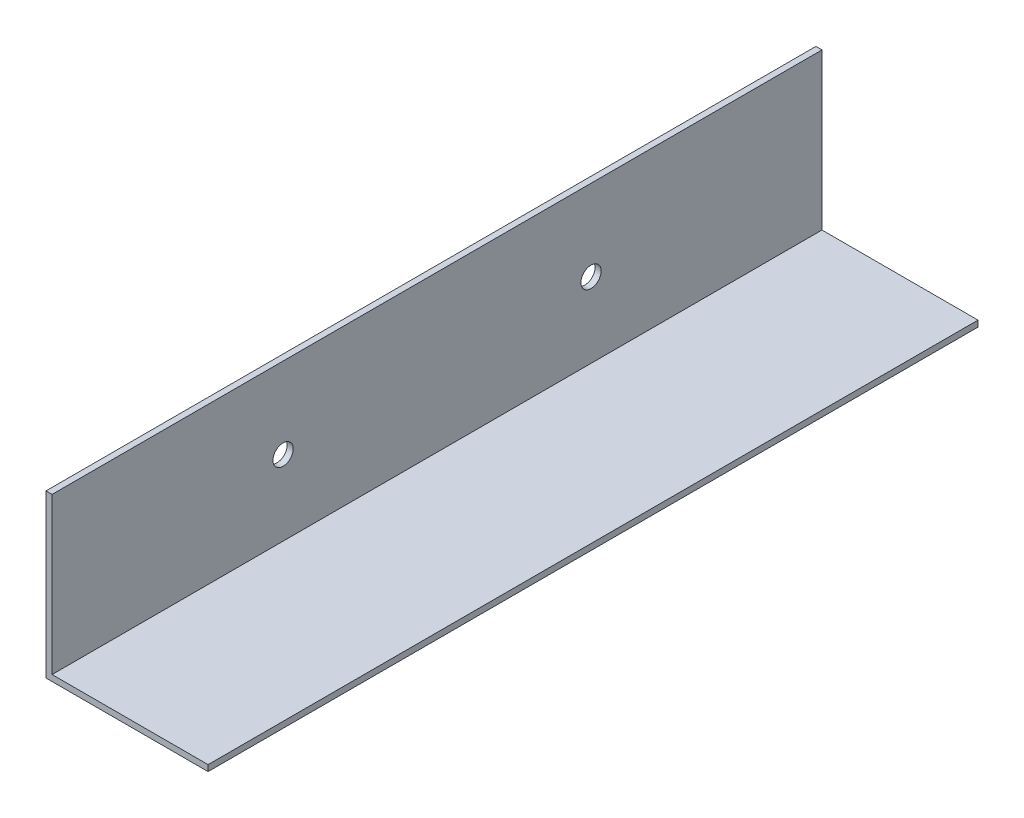
ISO-10303-21;
HEADER;
FILE_DESCRIPTION(('STEP AP214'),'2;1');
FILE_NAME('part.step','',(''),(''),'','','');
FILE_SCHEMA(('AUTOMOTIVE_DESIGN { 1 0 10303 214 1 1 1 1 }'));
ENDSEC;
DATA;
#1=APPLICATION_CONTEXT('core data for automotive mechanical design processes');
#2=APPLICATION_PROTOCOL_DEFINITION('international standard','automotive_design',2000,#1);
#3=PRODUCT_CONTEXT('',#1,'mechanical');
#4=PRODUCT('Part','Part','',(#3));
#5=PRODUCT_RELATED_PRODUCT_CATEGORY('part','',(#4));
#6=PRODUCT_DEFINITION_FORMATION('','',#4);
#7=PRODUCT_DEFINITION_CONTEXT('part definition',#1,'design');
#8=PRODUCT_DEFINITION('design','',#6,#7);
#9=PRODUCT_DEFINITION_SHAPE('','',#8);
#10=(LENGTH_UNIT() NAMED_UNIT(*) SI_UNIT(.MILLI.,.METRE.));
#11=(NAMED_UNIT(*) PLANE_ANGLE_UNIT() SI_UNIT($,.RADIAN.));
#12=(NAMED_UNIT(*) SI_UNIT($,.STERADIAN.) SOLID_ANGLE_UNIT());
#13=UNCERTAINTY_MEASURE_WITH_UNIT(LENGTH_MEASURE(1.E-05),#10,'distance_accuracy_value','');
#14=(GEOMETRIC_REPRESENTATION_CONTEXT(3) GLOBAL_UNCERTAINTY_ASSIGNED_CONTEXT((#13)) GLOBAL_UNIT_ASSIGNED_CONTEXT((#10,
#11,#12)) REPRESENTATION_CONTEXT('',''));
#15=CARTESIAN_POINT('',(0.,0.,0.));
#16=DIRECTION('',(0.,0.,1.));
#17=DIRECTION('',(1.,0.,0.));
#18=AXIS2_PLACEMENT_3D('',#15,#16,#17);
#19=CARTESIAN_POINT('',(0.,0.,190.));
#20=DIRECTION('',(0.,1.,0.));
#21=DIRECTION('',(0.,0.,1.));
#22=AXIS2_PLACEMENT_3D('',#19,#20,#21);
#23=PLANE('',#22);
#24=DIRECTION('',(1.,0.,0.));
#25=VECTOR('',#24,1.);
#26=CARTESIAN_POINT('',(0.,0.,0.));
#27=LINE('',#26,#25);
#28=CARTESIAN_POINT('',(0.,0.,0.));
#29=VERTEX_POINT('',#28);
#30=CARTESIAN_POINT('',(40.,0.,0.));
#31=VERTEX_POINT('',#30);
#32=EDGE_CURVE('E114',#29,#31,#27,.T.);
#33=ORIENTED_EDGE('',*,*,#32,.T.);
#34=DIRECTION('',(0.,0.,-1.));
#35=VECTOR('',#34,1.);
#36=CARTESIAN_POINT('',(40.,0.,190.));
#37=LINE('',#36,#35);
#38=CARTESIAN_POINT('',(40.,0.,190.));
#39=VERTEX_POINT('',#38);
#40=EDGE_CURVE('E11',#39,#31,#37,.T.);
#41=ORIENTED_EDGE('',*,*,#40,.F.);
#42=DIRECTION('',(1.,0.,0.));
#43=VECTOR('',#42,1.);
#44=CARTESIAN_POINT('',(0.,0.,190.));
#45=LINE('',#44,#43);
#46=CARTESIAN_POINT('',(0.,0.,190.));
#47=VERTEX_POINT('',#46);
#48=EDGE_CURVE('E79',#47,#39,#45,.T.);
#49=ORIENTED_EDGE('',*,*,#48,.F.);
#50=DIRECTION('',(0.,0.,-1.));
#51=VECTOR('',#50,1.);
#52=CARTESIAN_POINT('',(0.,0.,190.));
#53=LINE('',#52,#51);
#54=EDGE_CURVE('E110',#47,#29,#53,.T.);
#55=ORIENTED_EDGE('',*,*,#54,.T.);
#56=EDGE_LOOP('',(#33,#41,#49,#55));
#57=FACE_BOUND('',#56,.T.);
#58=ADVANCED_FACE('F33',(#57),#23,.F.);
#59=CARTESIAN_POINT('',(40.,1.5,190.));
#60=DIRECTION('',(1.,0.,0.));
#61=DIRECTION('',(0.,0.,-1.));
#62=AXIS2_PLACEMENT_3D('',#59,#60,#61);
#63=PLANE('',#62);
#64=DIRECTION('',(0.,-1.,0.));
#65=VECTOR('',#64,1.);
#66=CARTESIAN_POINT('',(40.,1.5,0.));
#67=LINE('',#66,#65);
#68=CARTESIAN_POINT('',(40.,1.5,0.));
#69=VERTEX_POINT('',#68);
#70=EDGE_CURVE('E117',#69,#31,#67,.T.);
#71=ORIENTED_EDGE('',*,*,#70,.F.);
#72=DIRECTION('',(0.,0.,-1.));
#73=VECTOR('',#72,1.);
#74=CARTESIAN_POINT('',(40.,1.5,190.));
#75=LINE('',#74,#73);
#76=CARTESIAN_POINT('',(40.,1.5,190.));
#77=VERTEX_POINT('',#76);
#78=EDGE_CURVE('E41',#77,#69,#75,.T.);
#79=ORIENTED_EDGE('',*,*,#78,.F.);
#80=DIRECTION('',(0.,-1.,0.));
#81=VECTOR('',#80,1.);
#82=CARTESIAN_POINT('',(40.,1.5,190.));
#83=LINE('',#82,#81);
#84=EDGE_CURVE('E181',#77,#39,#83,.T.);
#85=ORIENTED_EDGE('',*,*,#84,.T.);
#86=ORIENTED_EDGE('',*,*,#40,.T.);
#87=EDGE_LOOP('',(#71,#79,#85,#86));
#88=FACE_BOUND('',#87,.T.);
#89=ADVANCED_FACE('F136',(#88),#63,.T.);
#90=CARTESIAN_POINT('',(0.,1.5,190.));
#91=DIRECTION('',(0.,1.,0.));
#92=DIRECTION('',(0.,0.,1.));
#93=AXIS2_PLACEMENT_3D('',#90,#91,#92);
#94=PLANE('',#93);
#95=DIRECTION('',(1.,0.,0.));
#96=VECTOR('',#95,1.);
#97=CARTESIAN_POINT('',(0.,1.5,0.));
#98=LINE('',#97,#96);
#99=CARTESIAN_POINT('',(1.5,1.5,0.));
#100=VERTEX_POINT('',#99);
#101=EDGE_CURVE('E121',#100,#69,#98,.T.);
#102=ORIENTED_EDGE('',*,*,#101,.F.);
#103=DIRECTION('',(0.,0.,-1.));
#104=VECTOR('',#103,1.);
#105=CARTESIAN_POINT('',(1.5,1.5,190.));
#106=LINE('',#105,#104);
#107=CARTESIAN_POINT('',(1.5,1.5,190.));
#108=VERTEX_POINT('',#107);
#109=EDGE_CURVE('E100',#108,#100,#106,.T.);
#110=ORIENTED_EDGE('',*,*,#109,.F.);
#111=DIRECTION('',(1.,0.,0.));
#112=VECTOR('',#111,1.);
#113=CARTESIAN_POINT('',(0.,1.5,190.));
#114=LINE('',#113,#112);
#115=EDGE_CURVE('E106',#108,#77,#114,.T.);
#116=ORIENTED_EDGE('',*,*,#115,.T.);
#117=ORIENTED_EDGE('',*,*,#78,.T.);
#118=EDGE_LOOP('',(#102,#110,#116,#117));
#119=FACE_BOUND('',#118,.T.);
#120=ADVANCED_FACE('F133',(#119),#94,.T.);
#121=CARTESIAN_POINT('',(1.5,40.,190.));
#122=DIRECTION('',(1.,0.,0.));
#123=DIRECTION('',(0.,1.,0.));
#124=AXIS2_PLACEMENT_3D('',#121,#122,#123);
#125=PLANE('',#124);
#126=CARTESIAN_POINT('',(1.49999999999999,20.,133.));
#127=DIRECTION('',(1.,0.,0.));
#128=DIRECTION('',(0.,1.,0.));
#129=AXIS2_PLACEMENT_3D('',#126,#127,#128);
#130=CIRCLE('',#129,2.5);
#131=CARTESIAN_POINT('',(1.49999999999999,22.5,133.));
#132=VERTEX_POINT('',#131);
#133=EDGE_CURVE('E170',#132,#132,#130,.T.);
#134=ORIENTED_EDGE('',*,*,#133,.F.);
#135=EDGE_LOOP('',(#134));
#136=FACE_BOUND('',#135,.T.);
#137=CARTESIAN_POINT('',(1.49999999999999,20.,57.));
#138=DIRECTION('',(1.,0.,0.));
#139=DIRECTION('',(0.,1.,0.));
#140=AXIS2_PLACEMENT_3D('',#137,#138,#139);
#141=CIRCLE('',#140,2.49999999999999);
#142=CARTESIAN_POINT('',(1.49999999999999,22.5,57.));
#143=VERTEX_POINT('',#142);
#144=EDGE_CURVE('E118',#143,#143,#141,.T.);
#145=ORIENTED_EDGE('',*,*,#144,.F.);
#146=EDGE_LOOP('',(#145));
#147=FACE_BOUND('',#146,.T.);
#148=DIRECTION('',(0.,-1.,0.));
#149=VECTOR('',#148,1.);
#150=CARTESIAN_POINT('',(1.5,40.,0.));
#151=LINE('',#150,#149);
#152=CARTESIAN_POINT('',(1.5,40.,0.));
#153=VERTEX_POINT('',#152);
#154=EDGE_CURVE('E95',#153,#100,#151,.T.);
#155=ORIENTED_EDGE('',*,*,#154,.F.);
#156=DIRECTION('',(0.,0.,-1.));
#157=VECTOR('',#156,1.);
#158=CARTESIAN_POINT('',(1.5,40.,190.));
#159=LINE('',#158,#157);
#160=CARTESIAN_POINT('',(1.5,40.,190.));
#161=VERTEX_POINT('',#160);
#162=EDGE_CURVE('E90',#161,#153,#159,.T.);
#163=ORIENTED_EDGE('',*,*,#162,.F.);
#164=DIRECTION('',(0.,-1.,0.));
#165=VECTOR('',#164,1.);
#166=CARTESIAN_POINT('',(1.5,40.,190.));
#167=LINE('',#166,#165);
#168=EDGE_CURVE('E93',#161,#108,#167,.T.);
#169=ORIENTED_EDGE('',*,*,#168,.T.);
#170=ORIENTED_EDGE('',*,*,#109,.T.);
#171=EDGE_LOOP('',(#155,#163,#169,#170));
#172=FACE_BOUND('',#171,.T.);
#173=ADVANCED_FACE('F92',(#136,#147,#172),#125,.T.);
#174=CARTESIAN_POINT('',(0.,40.,190.));
#175=DIRECTION('',(0.,1.,0.));
#176=DIRECTION('',(0.,0.,1.));
#177=AXIS2_PLACEMENT_3D('',#174,#175,#176);
#178=PLANE('',#177);
#179=DIRECTION('',(1.,0.,0.));
#180=VECTOR('',#179,1.);
#181=CARTESIAN_POINT('',(0.,40.,0.));
#182=LINE('',#181,#180);
#183=CARTESIAN_POINT('',(0.,40.,0.));
#184=VERTEX_POINT('',#183);
#185=EDGE_CURVE('E125',#184,#153,#182,.T.);
#186=ORIENTED_EDGE('',*,*,#185,.F.);
#187=DIRECTION('',(0.,0.,-1.));
#188=VECTOR('',#187,1.);
#189=CARTESIAN_POINT('',(0.,40.,190.));
#190=LINE('',#189,#188);
#191=CARTESIAN_POINT('',(0.,40.,190.));
#192=VERTEX_POINT('',#191);
#193=EDGE_CURVE('E70',#192,#184,#190,.T.);
#194=ORIENTED_EDGE('',*,*,#193,.F.);
#195=DIRECTION('',(1.,0.,0.));
#196=VECTOR('',#195,1.);
#197=CARTESIAN_POINT('',(0.,40.,190.));
#198=LINE('',#197,#196);
#199=EDGE_CURVE('E104',#192,#161,#198,.T.);
#200=ORIENTED_EDGE('',*,*,#199,.T.);
#201=ORIENTED_EDGE('',*,*,#162,.T.);
#202=EDGE_LOOP('',(#186,#194,#200,#201));
#203=FACE_BOUND('',#202,.T.);
#204=ADVANCED_FACE('F108',(#203),#178,.T.);
#205=CARTESIAN_POINT('',(0.,40.,190.));
#206=DIRECTION('',(1.,0.,0.));
#207=DIRECTION('',(0.,1.,0.));
#208=AXIS2_PLACEMENT_3D('',#205,#206,#207);
#209=PLANE('',#208);
#210=CARTESIAN_POINT('',(0.,20.,133.));
#211=DIRECTION('',(-1.,0.,0.));
#212=DIRECTION('',(0.,-1.,0.));
#213=AXIS2_PLACEMENT_3D('',#210,#211,#212);
#214=CIRCLE('',#213,2.5);
#215=CARTESIAN_POINT('',(0.,17.5,133.));
#216=VERTEX_POINT('',#215);
#217=EDGE_CURVE('E183',#216,#216,#214,.T.);
#218=ORIENTED_EDGE('',*,*,#217,.F.);
#219=EDGE_LOOP('',(#218));
#220=FACE_BOUND('',#219,.T.);
#221=CARTESIAN_POINT('',(0.,20.,57.));
#222=DIRECTION('',(-1.,0.,0.));
#223=DIRECTION('',(0.,-1.,0.));
#224=AXIS2_PLACEMENT_3D('',#221,#222,#223);
#225=CIRCLE('',#224,2.49999999999999);
#226=CARTESIAN_POINT('',(0.,17.5,57.));
#227=VERTEX_POINT('',#226);
#228=EDGE_CURVE('E174',#227,#227,#225,.T.);
#229=ORIENTED_EDGE('',*,*,#228,.F.);
#230=EDGE_LOOP('',(#229));
#231=FACE_BOUND('',#230,.T.);
#232=DIRECTION('',(0.,-1.,0.));
#233=VECTOR('',#232,1.);
#234=CARTESIAN_POINT('',(0.,40.,0.));
#235=LINE('',#234,#233);
#236=EDGE_CURVE('E73',#184,#29,#235,.T.);
#237=ORIENTED_EDGE('',*,*,#236,.T.);
#238=ORIENTED_EDGE('',*,*,#54,.F.);
#239=DIRECTION('',(0.,-1.,0.));
#240=VECTOR('',#239,1.);
#241=CARTESIAN_POINT('',(0.,40.,190.));
#242=LINE('',#241,#240);
#243=EDGE_CURVE('E49',#192,#47,#242,.T.);
#244=ORIENTED_EDGE('',*,*,#243,.F.);
#245=ORIENTED_EDGE('',*,*,#193,.T.);
#246=EDGE_LOOP('',(#237,#238,#244,#245));
#247=FACE_BOUND('',#246,.T.);
#248=ADVANCED_FACE('F141',(#220,#231,#247),#209,.F.);
#249=CARTESIAN_POINT('',(0.,0.,190.));
#250=DIRECTION('',(0.,0.,-1.));
#251=DIRECTION('',(-1.,0.,0.));
#252=AXIS2_PLACEMENT_3D('',#249,#250,#251);
#253=PLANE('',#252);
#254=ORIENTED_EDGE('',*,*,#48,.T.);
#255=ORIENTED_EDGE('',*,*,#84,.F.);
#256=ORIENTED_EDGE('',*,*,#115,.F.);
#257=ORIENTED_EDGE('',*,*,#168,.F.);
#258=ORIENTED_EDGE('',*,*,#199,.F.);
#259=ORIENTED_EDGE('',*,*,#243,.T.);
#260=EDGE_LOOP('',(#254,#255,#256,#257,#258,#259));
#261=FACE_BOUND('',#260,.T.);
#262=ADVANCED_FACE('F103',(#261),#253,.F.);
#263=CARTESIAN_POINT('',(0.,0.,0.));
#264=DIRECTION('',(0.,0.,-1.));
#265=DIRECTION('',(-1.,0.,0.));
#266=AXIS2_PLACEMENT_3D('',#263,#264,#265);
#267=PLANE('',#266);
#268=ORIENTED_EDGE('',*,*,#32,.F.);
#269=ORIENTED_EDGE('',*,*,#236,.F.);
#270=ORIENTED_EDGE('',*,*,#185,.T.);
#271=ORIENTED_EDGE('',*,*,#154,.T.);
#272=ORIENTED_EDGE('',*,*,#101,.T.);
#273=ORIENTED_EDGE('',*,*,#70,.T.);
#274=EDGE_LOOP('',(#268,#269,#270,#271,#272,#273));
#275=FACE_BOUND('',#274,.T.);
#276=ADVANCED_FACE('F139',(#275),#267,.T.);
#277=CARTESIAN_POINT('',(40.,20.,57.));
#278=DIRECTION('',(-1.,0.,0.));
#279=DIRECTION('',(0.,-1.,0.));
#280=AXIS2_PLACEMENT_3D('',#277,#278,#279);
#281=CYLINDRICAL_SURFACE('',#280,2.49999999999999);
#282=ORIENTED_EDGE('',*,*,#144,.T.);
#283=EDGE_LOOP('',(#282));
#284=FACE_BOUND('',#283,.T.);
#285=ORIENTED_EDGE('',*,*,#228,.T.);
#286=EDGE_LOOP('',(#285));
#287=FACE_BOUND('',#286,.T.);
#288=ADVANCED_FACE('F188',(#284,#287),#281,.F.);
#289=CARTESIAN_POINT('',(40.,20.,133.));
#290=DIRECTION('',(-1.,0.,0.));
#291=DIRECTION('',(0.,-1.,0.));
#292=AXIS2_PLACEMENT_3D('',#289,#290,#291);
#293=CYLINDRICAL_SURFACE('',#292,2.5);
#294=ORIENTED_EDGE('',*,*,#133,.T.);
#295=EDGE_LOOP('',(#294));
#296=FACE_BOUND('',#295,.T.);
#297=ORIENTED_EDGE('',*,*,#217,.T.);
#298=EDGE_LOOP('',(#297));
#299=FACE_BOUND('',#298,.T.);
#300=ADVANCED_FACE('F186',(#296,#299),#293,.F.);
#301=CLOSED_SHELL('',(#58,#89,#120,#173,#204,#248,#262,#276,#288,#300));
#302=MANIFOLD_SOLID_BREP('B2',#301);
#303=ADVANCED_BREP_SHAPE_REPRESENTATION('',(#18,#302),#14);
#304=SHAPE_DEFINITION_REPRESENTATION(#9,#303);
ENDSEC;
END-ISO-10303-21;
